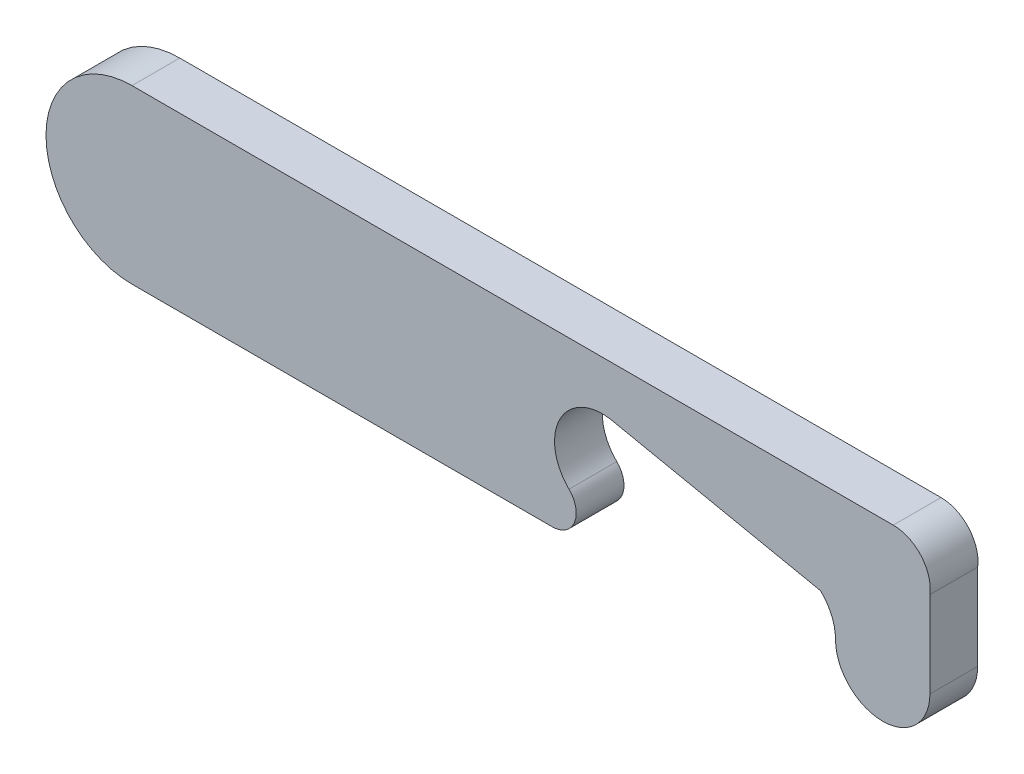
ISO-10303-21;
HEADER;
FILE_DESCRIPTION(('STEP AP214'),'2;1');
FILE_NAME('part.step','',(''),(''),'','','');
FILE_SCHEMA(('AUTOMOTIVE_DESIGN { 1 0 10303 214 1 1 1 1 }'));
ENDSEC;
DATA;
#1=APPLICATION_CONTEXT('core data for automotive mechanical design processes');
#2=APPLICATION_PROTOCOL_DEFINITION('international standard','automotive_design',2000,#1);
#3=PRODUCT_CONTEXT('',#1,'mechanical');
#4=PRODUCT('Part','Part','',(#3));
#5=PRODUCT_RELATED_PRODUCT_CATEGORY('part','',(#4));
#6=PRODUCT_DEFINITION_FORMATION('','',#4);
#7=PRODUCT_DEFINITION_CONTEXT('part definition',#1,'design');
#8=PRODUCT_DEFINITION('design','',#6,#7);
#9=PRODUCT_DEFINITION_SHAPE('','',#8);
#10=(LENGTH_UNIT() NAMED_UNIT(*) SI_UNIT(.MILLI.,.METRE.));
#11=(NAMED_UNIT(*) PLANE_ANGLE_UNIT() SI_UNIT($,.RADIAN.));
#12=(NAMED_UNIT(*) SI_UNIT($,.STERADIAN.) SOLID_ANGLE_UNIT());
#13=UNCERTAINTY_MEASURE_WITH_UNIT(LENGTH_MEASURE(1.E-05),#10,'distance_accuracy_value','');
#14=(GEOMETRIC_REPRESENTATION_CONTEXT(3) GLOBAL_UNCERTAINTY_ASSIGNED_CONTEXT((#13)) GLOBAL_UNIT_ASSIGNED_CONTEXT((#10,
#11,#12)) REPRESENTATION_CONTEXT('',''));
#15=CARTESIAN_POINT('',(0.,0.,0.));
#16=DIRECTION('',(0.,0.,1.));
#17=DIRECTION('',(1.,0.,0.));
#18=AXIS2_PLACEMENT_3D('',#15,#16,#17);
#19=CARTESIAN_POINT('',(5907.51269427003,7762.33787880805,5000.));
#20=DIRECTION('',(0.,1.,0.));
#21=DIRECTION('',(-1.,0.,0.));
#22=AXIS2_PLACEMENT_3D('',#19,#20,#21);
#23=PLANE('',#22);
#24=DIRECTION('',(1.,0.,0.));
#25=VECTOR('',#24,1.);
#26=CARTESIAN_POINT('',(5907.51269427003,7762.33787880805,0.));
#27=LINE('',#26,#25);
#28=CARTESIAN_POINT('',(5907.51269427003,7762.33787880805,0.));
#29=VERTEX_POINT('',#28);
#30=CARTESIAN_POINT('',(85590.03917175,7762.33787880804,0.));
#31=VERTEX_POINT('',#30);
#32=EDGE_CURVE('E149',#29,#31,#27,.T.);
#33=ORIENTED_EDGE('',*,*,#32,.F.);
#34=DIRECTION('',(0.,0.,-1.));
#35=VECTOR('',#34,1.);
#36=CARTESIAN_POINT('',(5907.51269427003,7762.33787880805,5000.));
#37=LINE('',#36,#35);
#38=CARTESIAN_POINT('',(5907.51269427003,7762.33787880805,5000.));
#39=VERTEX_POINT('',#38);
#40=EDGE_CURVE('E11',#39,#29,#37,.T.);
#41=ORIENTED_EDGE('',*,*,#40,.F.);
#42=DIRECTION('',(1.,0.,0.));
#43=VECTOR('',#42,1.);
#44=CARTESIAN_POINT('',(5907.51269427003,7762.33787880805,5000.));
#45=LINE('',#44,#43);
#46=CARTESIAN_POINT('',(85590.03917175,7762.33787880804,5000.));
#47=VERTEX_POINT('',#46);
#48=EDGE_CURVE('E171',#39,#47,#45,.T.);
#49=ORIENTED_EDGE('',*,*,#48,.T.);
#50=DIRECTION('',(0.,0.,-1.));
#51=VECTOR('',#50,1.);
#52=CARTESIAN_POINT('',(85590.03917175,7762.33787880804,5000.));
#53=LINE('',#52,#51);
#54=EDGE_CURVE('E45',#47,#31,#53,.T.);
#55=ORIENTED_EDGE('',*,*,#54,.T.);
#56=EDGE_LOOP('',(#33,#41,#49,#55));
#57=FACE_BOUND('',#56,.T.);
#58=ADVANCED_FACE('F39',(#57),#23,.T.);
#59=CARTESIAN_POINT('',(5907.51269427003,-1237.66212119195,5000.));
#60=DIRECTION('',(0.,0.,-1.));
#61=DIRECTION('',(-1.,0.,0.));
#62=AXIS2_PLACEMENT_3D('',#59,#60,#61);
#63=CYLINDRICAL_SURFACE('',#62,9000.);
#64=CARTESIAN_POINT('',(5907.51269427003,-1237.66212119195,0.));
#65=DIRECTION('',(0.,0.,1.));
#66=DIRECTION('',(1.,0.,0.));
#67=AXIS2_PLACEMENT_3D('',#64,#65,#66);
#68=CIRCLE('',#67,9000.);
#69=CARTESIAN_POINT('',(5907.51269427003,-10237.662121192,0.));
#70=VERTEX_POINT('',#69);
#71=EDGE_CURVE('E89',#29,#70,#68,.T.);
#72=ORIENTED_EDGE('',*,*,#71,.T.);
#73=DIRECTION('',(0.,0.,-1.));
#74=VECTOR('',#73,1.);
#75=CARTESIAN_POINT('',(5907.51269427003,-10237.662121192,5000.));
#76=LINE('',#75,#74);
#77=CARTESIAN_POINT('',(5907.51269427003,-10237.662121192,5000.));
#78=VERTEX_POINT('',#77);
#79=EDGE_CURVE('E48',#78,#70,#76,.T.);
#80=ORIENTED_EDGE('',*,*,#79,.F.);
#81=CARTESIAN_POINT('',(5907.51269427003,-1237.66212119195,5000.));
#82=DIRECTION('',(0.,0.,1.));
#83=DIRECTION('',(1.,0.,0.));
#84=AXIS2_PLACEMENT_3D('',#81,#82,#83);
#85=CIRCLE('',#84,9000.);
#86=EDGE_CURVE('E130',#39,#78,#85,.T.);
#87=ORIENTED_EDGE('',*,*,#86,.F.);
#88=ORIENTED_EDGE('',*,*,#40,.T.);
#89=EDGE_LOOP('',(#72,#80,#87,#88));
#90=FACE_BOUND('',#89,.T.);
#91=ADVANCED_FACE('F227',(#90),#63,.T.);
#92=CARTESIAN_POINT('',(5907.51269427003,-10237.662121192,5000.));
#93=DIRECTION('',(0.,1.,0.));
#94=DIRECTION('',(0.,0.,1.));
#95=AXIS2_PLACEMENT_3D('',#92,#93,#94);
#96=PLANE('',#95);
#97=DIRECTION('',(1.,0.,0.));
#98=VECTOR('',#97,1.);
#99=CARTESIAN_POINT('',(5907.51269427003,-10237.662121192,0.));
#100=LINE('',#99,#98);
#101=CARTESIAN_POINT('',(49907.51269427,-10237.662121192,0.));
#102=VERTEX_POINT('',#101);
#103=EDGE_CURVE('E134',#70,#102,#100,.T.);
#104=ORIENTED_EDGE('',*,*,#103,.T.);
#105=DIRECTION('',(0.,0.,-1.));
#106=VECTOR('',#105,1.);
#107=CARTESIAN_POINT('',(49907.51269427,-10237.662121192,5000.));
#108=LINE('',#107,#106);
#109=CARTESIAN_POINT('',(49907.51269427,-10237.662121192,5000.));
#110=VERTEX_POINT('',#109);
#111=EDGE_CURVE('E133',#110,#102,#108,.T.);
#112=ORIENTED_EDGE('',*,*,#111,.F.);
#113=DIRECTION('',(1.,0.,0.));
#114=VECTOR('',#113,1.);
#115=CARTESIAN_POINT('',(5907.51269427003,-10237.662121192,5000.));
#116=LINE('',#115,#114);
#117=EDGE_CURVE('E117',#78,#110,#116,.T.);
#118=ORIENTED_EDGE('',*,*,#117,.F.);
#119=ORIENTED_EDGE('',*,*,#79,.T.);
#120=EDGE_LOOP('',(#104,#112,#118,#119));
#121=FACE_BOUND('',#120,.T.);
#122=ADVANCED_FACE('F135',(#121),#96,.F.);
#123=CARTESIAN_POINT('',(49907.51269427,-7737.66212119195,5000.));
#124=DIRECTION('',(0.,0.,-1.));
#125=DIRECTION('',(-1.,0.,0.));
#126=AXIS2_PLACEMENT_3D('',#123,#124,#125);
#127=CYLINDRICAL_SURFACE('',#126,2500.);
#128=CARTESIAN_POINT('',(49907.51269427,-7737.66212119195,0.));
#129=DIRECTION('',(0.,0.,1.));
#130=DIRECTION('',(1.,0.,0.));
#131=AXIS2_PLACEMENT_3D('',#128,#129,#130);
#132=CIRCLE('',#131,2500.);
#133=CARTESIAN_POINT('',(51651.3370020691,-5946.27249759548,0.));
#134=VERTEX_POINT('',#133);
#135=EDGE_CURVE('E168',#102,#134,#132,.T.);
#136=ORIENTED_EDGE('',*,*,#135,.T.);
#137=DIRECTION('',(0.,0.,-1.));
#138=VECTOR('',#137,1.);
#139=CARTESIAN_POINT('',(51651.3370020691,-5946.27249759548,5000.));
#140=LINE('',#139,#138);
#141=CARTESIAN_POINT('',(51651.3370020691,-5946.27249759548,5000.));
#142=VERTEX_POINT('',#141);
#143=EDGE_CURVE('E140',#142,#134,#140,.T.);
#144=ORIENTED_EDGE('',*,*,#143,.F.);
#145=CARTESIAN_POINT('',(49907.51269427,-7737.66212119195,5000.));
#146=DIRECTION('',(0.,0.,1.));
#147=DIRECTION('',(1.,0.,0.));
#148=AXIS2_PLACEMENT_3D('',#145,#146,#147);
#149=CIRCLE('',#148,2500.);
#150=EDGE_CURVE('E123',#110,#142,#149,.T.);
#151=ORIENTED_EDGE('',*,*,#150,.F.);
#152=ORIENTED_EDGE('',*,*,#111,.T.);
#153=EDGE_LOOP('',(#136,#144,#151,#152));
#154=FACE_BOUND('',#153,.T.);
#155=ADVANCED_FACE('F136',(#154),#127,.T.);
#156=CARTESIAN_POINT('',(55138.9856176672,-2363.49325040253,5000.));
#157=DIRECTION('',(0.,0.,-1.));
#158=DIRECTION('',(-1.,0.,0.));
#159=AXIS2_PLACEMENT_3D('',#156,#157,#158);
#160=CYLINDRICAL_SURFACE('',#159,5000.);
#161=CARTESIAN_POINT('',(55138.9856176672,-2363.49325040253,0.));
#162=DIRECTION('',(0.,0.,-1.));
#163=DIRECTION('',(-1.,0.,0.));
#164=AXIS2_PLACEMENT_3D('',#161,#162,#163);
#165=CIRCLE('',#164,5000.);
#166=CARTESIAN_POINT('',(55942.725833298,2571.48412196483,0.));
#167=VERTEX_POINT('',#166);
#168=EDGE_CURVE('E170',#134,#167,#165,.T.);
#169=ORIENTED_EDGE('',*,*,#168,.T.);
#170=DIRECTION('',(0.,0.,-1.));
#171=VECTOR('',#170,1.);
#172=CARTESIAN_POINT('',(55942.725833298,2571.48412196483,5000.));
#173=LINE('',#172,#171);
#174=CARTESIAN_POINT('',(55942.725833298,2571.48412196483,5000.));
#175=VERTEX_POINT('',#174);
#176=EDGE_CURVE('E180',#175,#167,#173,.T.);
#177=ORIENTED_EDGE('',*,*,#176,.F.);
#178=CARTESIAN_POINT('',(55138.9856176672,-2363.49325040253,5000.));
#179=DIRECTION('',(0.,0.,-1.));
#180=DIRECTION('',(-1.,0.,0.));
#181=AXIS2_PLACEMENT_3D('',#178,#179,#180);
#182=CIRCLE('',#181,5000.);
#183=EDGE_CURVE('E142',#142,#175,#182,.T.);
#184=ORIENTED_EDGE('',*,*,#183,.F.);
#185=ORIENTED_EDGE('',*,*,#143,.T.);
#186=EDGE_LOOP('',(#169,#177,#184,#185));
#187=FACE_BOUND('',#186,.T.);
#188=ADVANCED_FACE('F192',(#187),#160,.F.);
#189=CARTESIAN_POINT('',(77975.8540268731,-1988.25951178063,5000.));
#190=DIRECTION('',(-0.202655272610909,-0.979250141936675,0.));
#191=DIRECTION('',(0.979250141936675,-0.202655272610909,0.));
#192=AXIS2_PLACEMENT_3D('',#189,#190,#191);
#193=PLANE('',#192);
#194=DIRECTION('',(-0.979250141936675,0.202655272610909,0.));
#195=VECTOR('',#194,1.);
#196=CARTESIAN_POINT('',(77975.8540268731,-1988.25951178063,0.));
#197=LINE('',#196,#195);
#198=CARTESIAN_POINT('',(77975.8540268731,-1988.25951178063,0.));
#199=VERTEX_POINT('',#198);
#200=EDGE_CURVE('E163',#199,#167,#197,.T.);
#201=ORIENTED_EDGE('',*,*,#200,.F.);
#202=DIRECTION('',(0.,0.,-1.));
#203=VECTOR('',#202,1.);
#204=CARTESIAN_POINT('',(77975.8540268731,-1988.25951178063,5000.));
#205=LINE('',#204,#203);
#206=CARTESIAN_POINT('',(77975.8540268731,-1988.25951178063,5000.));
#207=VERTEX_POINT('',#206);
#208=EDGE_CURVE('E176',#207,#199,#205,.T.);
#209=ORIENTED_EDGE('',*,*,#208,.F.);
#210=DIRECTION('',(-0.979250141936675,0.202655272610909,0.));
#211=VECTOR('',#210,1.);
#212=CARTESIAN_POINT('',(77975.8540268731,-1988.25951178063,5000.));
#213=LINE('',#212,#211);
#214=EDGE_CURVE('E145',#207,#175,#213,.T.);
#215=ORIENTED_EDGE('',*,*,#214,.T.);
#216=ORIENTED_EDGE('',*,*,#176,.T.);
#217=EDGE_LOOP('',(#201,#209,#215,#216));
#218=FACE_BOUND('',#217,.T.);
#219=ADVANCED_FACE('F230',(#218),#193,.T.);
#220=CARTESIAN_POINT('',(74547.0465314008,-5627.39116081351,5000.));
#221=DIRECTION('',(0.,0.,-1.));
#222=DIRECTION('',(-1.,0.,0.));
#223=AXIS2_PLACEMENT_3D('',#220,#221,#222);
#224=CYLINDRICAL_SURFACE('',#223,5000.);
#225=CARTESIAN_POINT('',(74547.0465314008,-5627.39116081351,0.));
#226=DIRECTION('',(0.,0.,1.));
#227=DIRECTION('',(1.,0.,0.));
#228=AXIS2_PLACEMENT_3D('',#225,#226,#227);
#229=CIRCLE('',#228,5000.);
#230=CARTESIAN_POINT('',(79547.0465314008,-5627.39116081351,0.));
#231=VERTEX_POINT('',#230);
#232=EDGE_CURVE('E161',#231,#199,#229,.T.);
#233=ORIENTED_EDGE('',*,*,#232,.F.);
#234=DIRECTION('',(0.,0.,-1.));
#235=VECTOR('',#234,1.);
#236=CARTESIAN_POINT('',(79547.0465314008,-5627.39116081351,5000.));
#237=LINE('',#236,#235);
#238=CARTESIAN_POINT('',(79547.0465314008,-5627.39116081351,5000.));
#239=VERTEX_POINT('',#238);
#240=EDGE_CURVE('E182',#239,#231,#237,.T.);
#241=ORIENTED_EDGE('',*,*,#240,.F.);
#242=CARTESIAN_POINT('',(74547.0465314008,-5627.39116081351,5000.));
#243=DIRECTION('',(0.,0.,1.));
#244=DIRECTION('',(1.,0.,0.));
#245=AXIS2_PLACEMENT_3D('',#242,#243,#244);
#246=CIRCLE('',#245,5000.);
#247=EDGE_CURVE('E196',#239,#207,#246,.T.);
#248=ORIENTED_EDGE('',*,*,#247,.T.);
#249=ORIENTED_EDGE('',*,*,#208,.T.);
#250=EDGE_LOOP('',(#233,#241,#248,#249));
#251=FACE_BOUND('',#250,.T.);
#252=ADVANCED_FACE('F201',(#251),#224,.F.);
#253=CARTESIAN_POINT('',(84486.967683967,-5627.39116081351,5000.));
#254=DIRECTION('',(0.,0.,-1.));
#255=DIRECTION('',(-1.,0.,0.));
#256=AXIS2_PLACEMENT_3D('',#253,#254,#255);
#257=CYLINDRICAL_SURFACE('',#256,4939.92115256621);
#258=CARTESIAN_POINT('',(84486.967683967,-5627.39116081351,0.));
#259=DIRECTION('',(0.,0.,-1.));
#260=DIRECTION('',(-1.,0.,0.));
#261=AXIS2_PLACEMENT_3D('',#258,#259,#260);
#262=CIRCLE('',#261,4939.92115256621);
#263=CARTESIAN_POINT('',(89426.8888365332,-5627.39116081351,0.));
#264=VERTEX_POINT('',#263);
#265=EDGE_CURVE('E158',#264,#231,#262,.T.);
#266=ORIENTED_EDGE('',*,*,#265,.F.);
#267=DIRECTION('',(0.,0.,-1.));
#268=VECTOR('',#267,1.);
#269=CARTESIAN_POINT('',(89426.8888365332,-5627.39116081351,5000.));
#270=LINE('',#269,#268);
#271=CARTESIAN_POINT('',(89426.8888365332,-5627.39116081351,5000.));
#272=VERTEX_POINT('',#271);
#273=EDGE_CURVE('E181',#272,#264,#270,.T.);
#274=ORIENTED_EDGE('',*,*,#273,.F.);
#275=CARTESIAN_POINT('',(84486.967683967,-5627.39116081351,5000.));
#276=DIRECTION('',(0.,0.,-1.));
#277=DIRECTION('',(-1.,0.,0.));
#278=AXIS2_PLACEMENT_3D('',#275,#276,#277);
#279=CIRCLE('',#278,4939.92115256621);
#280=EDGE_CURVE('E202',#272,#239,#279,.T.);
#281=ORIENTED_EDGE('',*,*,#280,.T.);
#282=ORIENTED_EDGE('',*,*,#240,.T.);
#283=EDGE_LOOP('',(#266,#274,#281,#282));
#284=FACE_BOUND('',#283,.T.);
#285=ADVANCED_FACE('F218',(#284),#257,.T.);
#286=CARTESIAN_POINT('',(89426.8888365332,3372.60883918649,5000.));
#287=DIRECTION('',(1.,0.,0.));
#288=DIRECTION('',(0.,0.,-1.));
#289=AXIS2_PLACEMENT_3D('',#286,#287,#288);
#290=PLANE('',#289);
#291=DIRECTION('',(0.,-1.,0.));
#292=VECTOR('',#291,1.);
#293=CARTESIAN_POINT('',(89426.8888365332,3372.60883918649,0.));
#294=LINE('',#293,#292);
#295=CARTESIAN_POINT('',(89426.8888365332,3372.60883918649,0.));
#296=VERTEX_POINT('',#295);
#297=EDGE_CURVE('E154',#296,#264,#294,.T.);
#298=ORIENTED_EDGE('',*,*,#297,.F.);
#299=DIRECTION('',(0.,0.,-1.));
#300=VECTOR('',#299,1.);
#301=CARTESIAN_POINT('',(89426.8888365332,3372.60883918649,5000.));
#302=LINE('',#301,#300);
#303=CARTESIAN_POINT('',(89426.8888365332,3372.60883918649,5000.));
#304=VERTEX_POINT('',#303);
#305=EDGE_CURVE('E184',#304,#296,#302,.T.);
#306=ORIENTED_EDGE('',*,*,#305,.F.);
#307=DIRECTION('',(0.,-1.,0.));
#308=VECTOR('',#307,1.);
#309=CARTESIAN_POINT('',(89426.8888365332,3372.60883918649,5000.));
#310=LINE('',#309,#308);
#311=EDGE_CURVE('E210',#304,#272,#310,.T.);
#312=ORIENTED_EDGE('',*,*,#311,.T.);
#313=ORIENTED_EDGE('',*,*,#273,.T.);
#314=EDGE_LOOP('',(#298,#306,#312,#313));
#315=FACE_BOUND('',#314,.T.);
#316=ADVANCED_FACE('F216',(#315),#290,.T.);
#317=CARTESIAN_POINT('',(85590.03917175,3890.67107606909,5000.));
#318=DIRECTION('',(0.,0.,-1.));
#319=DIRECTION('',(-1.,0.,0.));
#320=AXIS2_PLACEMENT_3D('',#317,#318,#319);
#321=CYLINDRICAL_SURFACE('',#320,3871.66680273896);
#322=CARTESIAN_POINT('',(85590.03917175,3890.67107606909,0.));
#323=DIRECTION('',(0.,0.,-1.));
#324=DIRECTION('',(-1.,0.,0.));
#325=AXIS2_PLACEMENT_3D('',#322,#323,#324);
#326=CIRCLE('',#325,3871.66680273896);
#327=EDGE_CURVE('E155',#31,#296,#326,.T.);
#328=ORIENTED_EDGE('',*,*,#327,.F.);
#329=ORIENTED_EDGE('',*,*,#54,.F.);
#330=CARTESIAN_POINT('',(85590.03917175,3890.67107606909,5000.));
#331=DIRECTION('',(0.,0.,-1.));
#332=DIRECTION('',(-1.,0.,0.));
#333=AXIS2_PLACEMENT_3D('',#330,#331,#332);
#334=CIRCLE('',#333,3871.66680273896);
#335=EDGE_CURVE('E215',#47,#304,#334,.T.);
#336=ORIENTED_EDGE('',*,*,#335,.T.);
#337=ORIENTED_EDGE('',*,*,#305,.T.);
#338=EDGE_LOOP('',(#328,#329,#336,#337));
#339=FACE_BOUND('',#338,.T.);
#340=ADVANCED_FACE('F188',(#339),#321,.T.);
#341=CARTESIAN_POINT('',(85590.03917175,3890.67107606909,5000.));
#342=DIRECTION('',(0.,0.,-1.));
#343=DIRECTION('',(-1.,0.,0.));
#344=AXIS2_PLACEMENT_3D('',#341,#342,#343);
#345=PLANE('',#344);
#346=ORIENTED_EDGE('',*,*,#48,.F.);
#347=ORIENTED_EDGE('',*,*,#86,.T.);
#348=ORIENTED_EDGE('',*,*,#117,.T.);
#349=ORIENTED_EDGE('',*,*,#150,.T.);
#350=ORIENTED_EDGE('',*,*,#183,.T.);
#351=ORIENTED_EDGE('',*,*,#214,.F.);
#352=ORIENTED_EDGE('',*,*,#247,.F.);
#353=ORIENTED_EDGE('',*,*,#280,.F.);
#354=ORIENTED_EDGE('',*,*,#311,.F.);
#355=ORIENTED_EDGE('',*,*,#335,.F.);
#356=EDGE_LOOP('',(#346,#347,#348,#349,#350,#351,#352,#353,#354,#355));
#357=FACE_BOUND('',#356,.T.);
#358=ADVANCED_FACE('F124',(#357),#345,.F.);
#359=CARTESIAN_POINT('',(85590.03917175,3890.67107606909,0.));
#360=DIRECTION('',(0.,0.,-1.));
#361=DIRECTION('',(-1.,0.,0.));
#362=AXIS2_PLACEMENT_3D('',#359,#360,#361);
#363=PLANE('',#362);
#364=ORIENTED_EDGE('',*,*,#32,.T.);
#365=ORIENTED_EDGE('',*,*,#327,.T.);
#366=ORIENTED_EDGE('',*,*,#297,.T.);
#367=ORIENTED_EDGE('',*,*,#265,.T.);
#368=ORIENTED_EDGE('',*,*,#232,.T.);
#369=ORIENTED_EDGE('',*,*,#200,.T.);
#370=ORIENTED_EDGE('',*,*,#168,.F.);
#371=ORIENTED_EDGE('',*,*,#135,.F.);
#372=ORIENTED_EDGE('',*,*,#103,.F.);
#373=ORIENTED_EDGE('',*,*,#71,.F.);
#374=EDGE_LOOP('',(#364,#365,#366,#367,#368,#369,#370,#371,#372,#373));
#375=FACE_BOUND('',#374,.T.);
#376=ADVANCED_FACE('F186',(#375),#363,.T.);
#377=CLOSED_SHELL('',(#58,#91,#122,#155,#188,#219,#252,#285,#316,#340,#358,#376));
#378=MANIFOLD_SOLID_BREP('B2',#377);
#379=ADVANCED_BREP_SHAPE_REPRESENTATION('',(#18,#378),#14);
#380=SHAPE_DEFINITION_REPRESENTATION(#9,#379);
ENDSEC;
END-ISO-10303-21;
